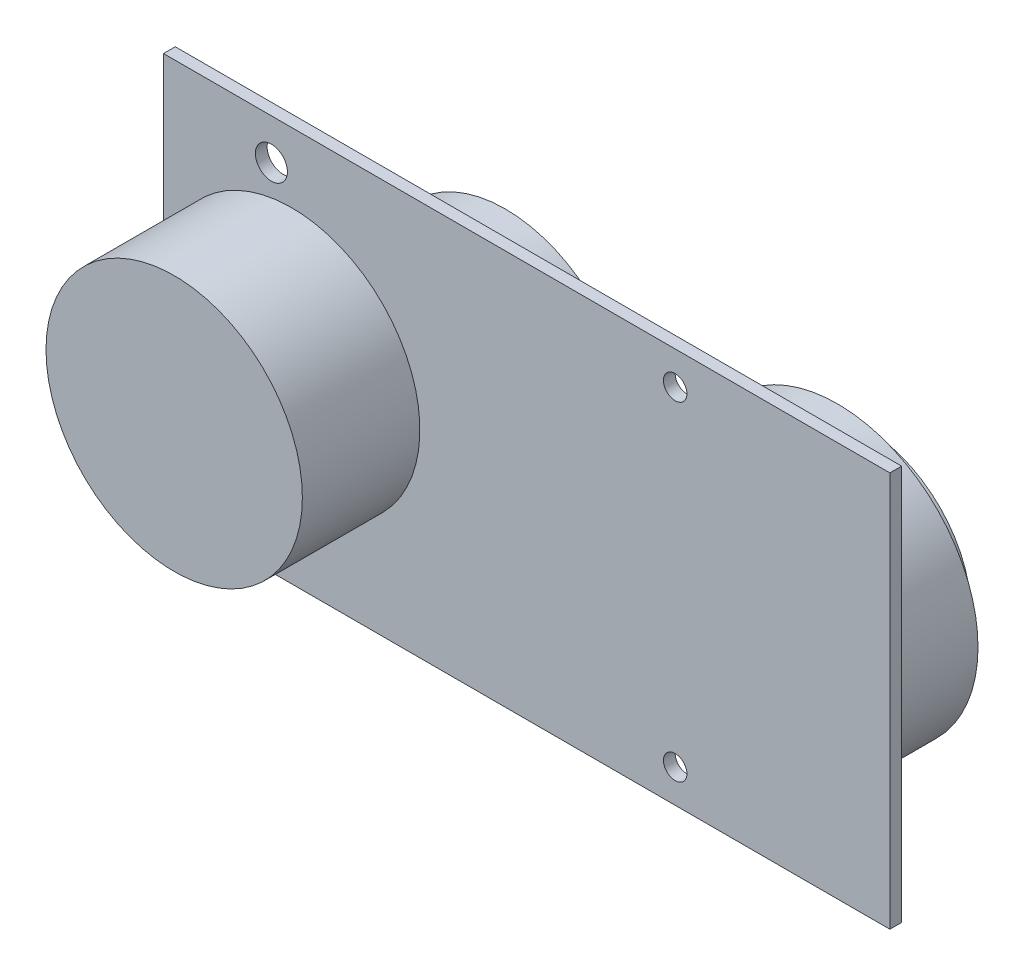
ISO-10303-21;
HEADER;
FILE_DESCRIPTION(('STEP AP214'),'2;1');
FILE_NAME('part.step','',(''),(''),'','','');
FILE_SCHEMA(('AUTOMOTIVE_DESIGN { 1 0 10303 214 1 1 1 1 }'));
ENDSEC;
DATA;
#1=APPLICATION_CONTEXT('core data for automotive mechanical design processes');
#2=APPLICATION_PROTOCOL_DEFINITION('international standard','automotive_design',2000,#1);
#3=PRODUCT_CONTEXT('',#1,'mechanical');
#4=PRODUCT('Part','Part','',(#3));
#5=PRODUCT_RELATED_PRODUCT_CATEGORY('part','',(#4));
#6=PRODUCT_DEFINITION_FORMATION('','',#4);
#7=PRODUCT_DEFINITION_CONTEXT('part definition',#1,'design');
#8=PRODUCT_DEFINITION('design','',#6,#7);
#9=PRODUCT_DEFINITION_SHAPE('','',#8);
#10=(LENGTH_UNIT() NAMED_UNIT(*) SI_UNIT(.MILLI.,.METRE.));
#11=(NAMED_UNIT(*) PLANE_ANGLE_UNIT() SI_UNIT($,.RADIAN.));
#12=(NAMED_UNIT(*) SI_UNIT($,.STERADIAN.) SOLID_ANGLE_UNIT());
#13=UNCERTAINTY_MEASURE_WITH_UNIT(LENGTH_MEASURE(1.E-05),#10,'distance_accuracy_value','');
#14=(GEOMETRIC_REPRESENTATION_CONTEXT(3) GLOBAL_UNCERTAINTY_ASSIGNED_CONTEXT((#13)) GLOBAL_UNIT_ASSIGNED_CONTEXT((#10,
#11,#12)) REPRESENTATION_CONTEXT('',''));
#15=CARTESIAN_POINT('',(0.,0.,0.));
#16=DIRECTION('',(0.,0.,1.));
#17=DIRECTION('',(1.,0.,0.));
#18=AXIS2_PLACEMENT_3D('',#15,#16,#17);
#19=CARTESIAN_POINT('',(13.5,3.6,-6.5));
#20=DIRECTION('',(0.,0.,1.));
#21=DIRECTION('',(1.,0.,0.));
#22=AXIS2_PLACEMENT_3D('',#19,#20,#21);
#23=CYLINDRICAL_SURFACE('',#22,11.8);
#24=DIRECTION('',(0.,0.,1.));
#25=VECTOR('',#24,1.);
#26=CARTESIAN_POINT('',(24.7938086489544,0.180952442447991,-4.4));
#27=LINE('',#26,#25);
#28=CARTESIAN_POINT('',(24.7938086489544,0.180952442447988,-6.5));
#29=VERTEX_POINT('',#28);
#30=CARTESIAN_POINT('',(24.7938086489544,0.180952442447991,-4.2));
#31=VERTEX_POINT('',#30);
#32=EDGE_CURVE('E265',#29,#31,#27,.T.);
#33=ORIENTED_EDGE('',*,*,#32,.F.);
#34=CARTESIAN_POINT('',(13.5,3.6,-6.5));
#35=DIRECTION('',(0.,0.,1.));
#36=DIRECTION('',(1.,0.,0.));
#37=AXIS2_PLACEMENT_3D('',#34,#35,#36);
#38=CIRCLE('',#37,11.8);
#39=CARTESIAN_POINT('',(1.75805879371044,2.43089063469696,-6.5));
#40=VERTEX_POINT('',#39);
#41=EDGE_CURVE('E199',#29,#40,#38,.T.);
#42=ORIENTED_EDGE('',*,*,#41,.T.);
#43=DIRECTION('',(0.,0.,1.));
#44=VECTOR('',#43,1.);
#45=CARTESIAN_POINT('',(1.75805879371044,2.43089063469696,-3.25));
#46=LINE('',#45,#44);
#47=CARTESIAN_POINT('',(1.75805879371044,2.43089063469696,-1.1));
#48=VERTEX_POINT('',#47);
#49=EDGE_CURVE('E158',#40,#48,#46,.T.);
#50=ORIENTED_EDGE('',*,*,#49,.T.);
#51=CARTESIAN_POINT('',(13.5,3.6,-1.1));
#52=DIRECTION('',(0.,0.,1.));
#53=DIRECTION('',(1.,0.,0.));
#54=AXIS2_PLACEMENT_3D('',#51,#52,#53);
#55=CIRCLE('',#54,11.8);
#56=CARTESIAN_POINT('',(22.8868703816798,10.7502912134781,-1.1));
#57=VERTEX_POINT('',#56);
#58=EDGE_CURVE('E184',#57,#48,#55,.T.);
#59=ORIENTED_EDGE('',*,*,#58,.F.);
#60=DIRECTION('',(0.,0.,1.));
#61=VECTOR('',#60,1.);
#62=CARTESIAN_POINT('',(22.8868703816798,10.7502912134781,-2.1));
#63=LINE('',#62,#61);
#64=CARTESIAN_POINT('',(22.8868703816798,10.7502912134781,-4.2));
#65=VERTEX_POINT('',#64);
#66=EDGE_CURVE('E146',#65,#57,#63,.T.);
#67=ORIENTED_EDGE('',*,*,#66,.F.);
#68=CARTESIAN_POINT('',(13.5,3.6,-4.2));
#69=DIRECTION('',(0.,0.,1.));
#70=DIRECTION('',(1.,0.,0.));
#71=AXIS2_PLACEMENT_3D('',#68,#69,#70);
#72=CIRCLE('',#71,11.8);
#73=EDGE_CURVE('E157',#65,#31,#72,.F.);
#74=ORIENTED_EDGE('',*,*,#73,.T.);
#75=EDGE_LOOP('',(#33,#42,#50,#59,#67,#74));
#76=FACE_BOUND('',#75,.T.);
#77=ADVANCED_FACE('F38',(#76),#23,.T.);
#78=CARTESIAN_POINT('',(26.7,-2.2,-4.2));
#79=DIRECTION('',(0.,0.,1.));
#80=DIRECTION('',(1.,0.,0.));
#81=AXIS2_PLACEMENT_3D('',#78,#79,#80);
#82=PLANE('',#81);
#83=CARTESIAN_POINT('',(42.6,0.,-4.2));
#84=DIRECTION('',(0.,0.,1.));
#85=DIRECTION('',(1.,0.,0.));
#86=AXIS2_PLACEMENT_3D('',#83,#84,#85);
#87=CIRCLE('',#86,13.15);
#88=CARTESIAN_POINT('',(29.4848009132115,-0.956061145483348,-4.2));
#89=VERTEX_POINT('',#88);
#90=CARTESIAN_POINT('',(33.4802744924266,9.47381162291688,-4.2));
#91=VERTEX_POINT('',#90);
#92=EDGE_CURVE('E275',#89,#91,#87,.F.);
#93=ORIENTED_EDGE('',*,*,#92,.F.);
#94=CARTESIAN_POINT('',(26.7,-2.2,-4.2));
#95=DIRECTION('',(0.,0.,1.));
#96=DIRECTION('',(1.,0.,0.));
#97=AXIS2_PLACEMENT_3D('',#94,#95,#96);
#98=CIRCLE('',#97,3.05);
#99=EDGE_CURVE('E11',#89,#31,#98,.T.);
#100=ORIENTED_EDGE('',*,*,#99,.T.);
#101=ORIENTED_EDGE('',*,*,#73,.F.);
#102=CARTESIAN_POINT('',(26.7,-2.2,-4.2));
#103=DIRECTION('',(0.,0.,1.));
#104=DIRECTION('',(1.,0.,0.));
#105=AXIS2_PLACEMENT_3D('',#102,#103,#104);
#106=CIRCLE('',#105,13.5);
#107=EDGE_CURVE('E176',#91,#65,#106,.T.);
#108=ORIENTED_EDGE('',*,*,#107,.F.);
#109=EDGE_LOOP('',(#93,#100,#101,#108));
#110=FACE_BOUND('',#109,.T.);
#111=ADVANCED_FACE('F281',(#110),#82,.F.);
#112=CARTESIAN_POINT('',(42.6,0.,-11.));
#113=DIRECTION('',(0.,0.,1.));
#114=DIRECTION('',(1.,0.,0.));
#115=AXIS2_PLACEMENT_3D('',#112,#113,#114);
#116=CYLINDRICAL_SURFACE('',#115,13.15);
#117=DIRECTION('',(0.,0.,1.));
#118=VECTOR('',#117,1.);
#119=CARTESIAN_POINT('',(29.7179431193908,-2.64104345377922,-4.4));
#120=LINE('',#119,#118);
#121=CARTESIAN_POINT('',(29.7179431193908,-2.64104345377922,-8.5));
#122=VERTEX_POINT('',#121);
#123=CARTESIAN_POINT('',(29.7179431193908,-2.64104345377922,-4.2));
#124=VERTEX_POINT('',#123);
#125=EDGE_CURVE('E53',#122,#124,#120,.T.);
#126=ORIENTED_EDGE('',*,*,#125,.F.);
#127=CARTESIAN_POINT('',(42.6,0.,-8.5));
#128=DIRECTION('',(0.,0.,-1.));
#129=DIRECTION('',(-1.,0.,0.));
#130=AXIS2_PLACEMENT_3D('',#127,#128,#129);
#131=CIRCLE('',#130,13.15);
#132=CARTESIAN_POINT('',(29.4848009132115,-0.956061145483349,-8.5));
#133=VERTEX_POINT('',#132);
#134=EDGE_CURVE('E206',#133,#122,#131,.T.);
#135=ORIENTED_EDGE('',*,*,#134,.F.);
#136=DIRECTION('',(0.,0.,1.));
#137=VECTOR('',#136,1.);
#138=CARTESIAN_POINT('',(29.4848009132115,-0.956061145483348,-4.4));
#139=LINE('',#138,#137);
#140=EDGE_CURVE('E272',#89,#133,#139,.F.);
#141=ORIENTED_EDGE('',*,*,#140,.F.);
#142=ORIENTED_EDGE('',*,*,#92,.T.);
#143=DIRECTION('',(0.,0.,1.));
#144=VECTOR('',#143,1.);
#145=CARTESIAN_POINT('',(33.4802744924266,9.47381162291688,-2.1));
#146=LINE('',#145,#144);
#147=CARTESIAN_POINT('',(33.4802744924266,9.47381162291688,-1.1));
#148=VERTEX_POINT('',#147);
#149=EDGE_CURVE('E188',#148,#91,#146,.F.);
#150=ORIENTED_EDGE('',*,*,#149,.F.);
#151=CARTESIAN_POINT('',(42.6,0.,-1.1));
#152=DIRECTION('',(0.,0.,1.));
#153=DIRECTION('',(1.,0.,0.));
#154=AXIS2_PLACEMENT_3D('',#151,#152,#153);
#155=CIRCLE('',#154,13.15);
#156=CARTESIAN_POINT('',(36.3953406831993,-11.5941667558492,-1.1));
#157=VERTEX_POINT('',#156);
#158=EDGE_CURVE('E187',#157,#148,#155,.T.);
#159=ORIENTED_EDGE('',*,*,#158,.F.);
#160=DIRECTION('',(0.,0.,1.));
#161=VECTOR('',#160,1.);
#162=CARTESIAN_POINT('',(36.3953406831993,-11.5941667558492,-2.1));
#163=LINE('',#162,#161);
#164=CARTESIAN_POINT('',(36.3953406831993,-11.5941667558492,-4.2));
#165=VERTEX_POINT('',#164);
#166=EDGE_CURVE('E189',#165,#157,#163,.T.);
#167=ORIENTED_EDGE('',*,*,#166,.F.);
#168=EDGE_CURVE('E276',#165,#124,#87,.F.);
#169=ORIENTED_EDGE('',*,*,#168,.T.);
#170=EDGE_LOOP('',(#126,#135,#141,#142,#150,#159,#167,#169));
#171=FACE_BOUND('',#170,.T.);
#172=ADVANCED_FACE('F283',(#171),#116,.T.);
#173=CARTESIAN_POINT('',(0.,0.,11.));
#174=DIRECTION('',(0.,0.,-1.));
#175=DIRECTION('',(-1.,0.,0.));
#176=AXIS2_PLACEMENT_3D('',#173,#174,#175);
#177=CYLINDRICAL_SURFACE('',#176,12.);
#178=CARTESIAN_POINT('',(0.,0.,11.));
#179=DIRECTION('',(0.,0.,1.));
#180=DIRECTION('',(1.,0.,0.));
#181=AXIS2_PLACEMENT_3D('',#178,#179,#180);
#182=CIRCLE('',#181,12.);
#183=CARTESIAN_POINT('',(12.,0.,11.));
#184=VERTEX_POINT('',#183);
#185=EDGE_CURVE('E248',#184,#184,#182,.T.);
#186=ORIENTED_EDGE('',*,*,#185,.F.);
#187=EDGE_LOOP('',(#186));
#188=FACE_BOUND('',#187,.T.);
#189=CARTESIAN_POINT('',(0.,0.,0.));
#190=DIRECTION('',(0.,0.,1.));
#191=DIRECTION('',(1.,0.,0.));
#192=AXIS2_PLACEMENT_3D('',#189,#190,#191);
#193=CIRCLE('',#192,12.);
#194=CARTESIAN_POINT('',(-12.,0.,0.));
#195=VERTEX_POINT('',#194);
#196=EDGE_CURVE('E247',#195,#195,#193,.T.);
#197=ORIENTED_EDGE('',*,*,#196,.T.);
#198=EDGE_LOOP('',(#197));
#199=FACE_BOUND('',#198,.T.);
#200=ADVANCED_FACE('F40',(#188,#199),#177,.T.);
#201=CARTESIAN_POINT('',(0.,0.,11.));
#202=DIRECTION('',(0.,0.,1.));
#203=DIRECTION('',(1.,0.,0.));
#204=AXIS2_PLACEMENT_3D('',#201,#202,#203);
#205=PLANE('',#204);
#206=ORIENTED_EDGE('',*,*,#185,.T.);
#207=EDGE_LOOP('',(#206));
#208=FACE_BOUND('',#207,.T.);
#209=ADVANCED_FACE('F413',(#208),#205,.T.);
#210=CARTESIAN_POINT('',(0.,0.,0.));
#211=DIRECTION('',(0.,0.,1.));
#212=DIRECTION('',(1.,0.,0.));
#213=AXIS2_PLACEMENT_3D('',#210,#211,#212);
#214=PLANE('',#213);
#215=CARTESIAN_POINT('',(-1.9,-14.7,0.));
#216=DIRECTION('',(0.,0.,1.));
#217=DIRECTION('',(1.,0.,0.));
#218=AXIS2_PLACEMENT_3D('',#215,#216,#217);
#219=CIRCLE('',#218,1.5);
#220=CARTESIAN_POINT('',(-0.400000000000001,-14.7,0.));
#221=VERTEX_POINT('',#220);
#222=EDGE_CURVE('E401',#221,#221,#219,.T.);
#223=ORIENTED_EDGE('',*,*,#222,.F.);
#224=EDGE_LOOP('',(#223));
#225=FACE_BOUND('',#224,.T.);
#226=CARTESIAN_POINT('',(-1.9,14.7,0.));
#227=DIRECTION('',(0.,0.,1.));
#228=DIRECTION('',(1.,0.,0.));
#229=AXIS2_PLACEMENT_3D('',#226,#227,#228);
#230=CIRCLE('',#229,1.5);
#231=CARTESIAN_POINT('',(-0.399999999999997,14.7,0.));
#232=VERTEX_POINT('',#231);
#233=EDGE_CURVE('E398',#232,#232,#230,.T.);
#234=ORIENTED_EDGE('',*,*,#233,.F.);
#235=EDGE_LOOP('',(#234));
#236=FACE_BOUND('',#235,.T.);
#237=CARTESIAN_POINT('',(35.9,15.4,0.));
#238=DIRECTION('',(0.,0.,1.));
#239=DIRECTION('',(1.,0.,0.));
#240=AXIS2_PLACEMENT_3D('',#237,#238,#239);
#241=CIRCLE('',#240,1.1);
#242=CARTESIAN_POINT('',(37.,15.4,0.));
#243=VERTEX_POINT('',#242);
#244=EDGE_CURVE('E395',#243,#243,#241,.T.);
#245=ORIENTED_EDGE('',*,*,#244,.F.);
#246=EDGE_LOOP('',(#245));
#247=FACE_BOUND('',#246,.T.);
#248=CARTESIAN_POINT('',(35.9,-15.4,0.));
#249=DIRECTION('',(0.,0.,1.));
#250=DIRECTION('',(1.,0.,0.));
#251=AXIS2_PLACEMENT_3D('',#248,#249,#250);
#252=CIRCLE('',#251,1.1);
#253=CARTESIAN_POINT('',(37.,-15.4,0.));
#254=VERTEX_POINT('',#253);
#255=EDGE_CURVE('E392',#254,#254,#252,.T.);
#256=ORIENTED_EDGE('',*,*,#255,.F.);
#257=EDGE_LOOP('',(#256));
#258=FACE_BOUND('',#257,.T.);
#259=DIRECTION('',(0.,-1.,0.));
#260=VECTOR('',#259,1.);
#261=CARTESIAN_POINT('',(-12.,18.5,0.));
#262=LINE('',#261,#260);
#263=CARTESIAN_POINT('',(-12.,18.5,0.));
#264=VERTEX_POINT('',#263);
#265=EDGE_CURVE('E223',#264,#195,#262,.T.);
#266=ORIENTED_EDGE('',*,*,#265,.T.);
#267=ORIENTED_EDGE('',*,*,#196,.F.);
#268=CARTESIAN_POINT('',(-12.,-18.5,0.));
#269=VERTEX_POINT('',#268);
#270=EDGE_CURVE('E227',#195,#269,#262,.T.);
#271=ORIENTED_EDGE('',*,*,#270,.T.);
#272=DIRECTION('',(1.,0.,0.));
#273=VECTOR('',#272,1.);
#274=CARTESIAN_POINT('',(-12.,-18.5,0.));
#275=LINE('',#274,#273);
#276=CARTESIAN_POINT('',(56.,-18.5,0.));
#277=VERTEX_POINT('',#276);
#278=EDGE_CURVE('E226',#269,#277,#275,.T.);
#279=ORIENTED_EDGE('',*,*,#278,.T.);
#280=DIRECTION('',(0.,-1.,0.));
#281=VECTOR('',#280,1.);
#282=CARTESIAN_POINT('',(56.,18.5,0.));
#283=LINE('',#282,#281);
#284=CARTESIAN_POINT('',(56.,18.5,0.));
#285=VERTEX_POINT('',#284);
#286=EDGE_CURVE('E230',#285,#277,#283,.T.);
#287=ORIENTED_EDGE('',*,*,#286,.F.);
#288=DIRECTION('',(1.,0.,0.));
#289=VECTOR('',#288,1.);
#290=CARTESIAN_POINT('',(-12.,18.5,0.));
#291=LINE('',#290,#289);
#292=EDGE_CURVE('E215',#264,#285,#291,.T.);
#293=ORIENTED_EDGE('',*,*,#292,.F.);
#294=EDGE_LOOP('',(#266,#267,#271,#279,#287,#293));
#295=FACE_BOUND('',#294,.T.);
#296=ADVANCED_FACE('F409',(#225,#236,#247,#258,#295),#214,.T.);
#297=CARTESIAN_POINT('',(-12.,18.5,-1.1));
#298=DIRECTION('',(-1.,0.,0.));
#299=DIRECTION('',(0.,0.,1.));
#300=AXIS2_PLACEMENT_3D('',#297,#298,#299);
#301=PLANE('',#300);
#302=ORIENTED_EDGE('',*,*,#265,.F.);
#303=DIRECTION('',(0.,0.,1.));
#304=VECTOR('',#303,1.);
#305=CARTESIAN_POINT('',(-12.,18.5,-1.1));
#306=LINE('',#305,#304);
#307=CARTESIAN_POINT('',(-12.,18.5,-1.1));
#308=VERTEX_POINT('',#307);
#309=EDGE_CURVE('E234',#308,#264,#306,.T.);
#310=ORIENTED_EDGE('',*,*,#309,.F.);
#311=DIRECTION('',(0.,-1.,0.));
#312=VECTOR('',#311,1.);
#313=CARTESIAN_POINT('',(-12.,18.5,-1.1));
#314=LINE('',#313,#312);
#315=CARTESIAN_POINT('',(-12.,-18.5,-1.1));
#316=VERTEX_POINT('',#315);
#317=EDGE_CURVE('E211',#308,#316,#314,.T.);
#318=ORIENTED_EDGE('',*,*,#317,.T.);
#319=DIRECTION('',(0.,0.,1.));
#320=VECTOR('',#319,1.);
#321=CARTESIAN_POINT('',(-12.,-18.5,-1.1));
#322=LINE('',#321,#320);
#323=EDGE_CURVE('E222',#316,#269,#322,.T.);
#324=ORIENTED_EDGE('',*,*,#323,.T.);
#325=ORIENTED_EDGE('',*,*,#270,.F.);
#326=EDGE_LOOP('',(#302,#310,#318,#324,#325));
#327=FACE_BOUND('',#326,.T.);
#328=ADVANCED_FACE('F412',(#327),#301,.T.);
#329=CARTESIAN_POINT('',(-12.,18.5,-1.1));
#330=DIRECTION('',(0.,-1.,0.));
#331=DIRECTION('',(0.,0.,-1.));
#332=AXIS2_PLACEMENT_3D('',#329,#330,#331);
#333=PLANE('',#332);
#334=ORIENTED_EDGE('',*,*,#292,.T.);
#335=DIRECTION('',(0.,0.,1.));
#336=VECTOR('',#335,1.);
#337=CARTESIAN_POINT('',(56.,18.5,-1.1));
#338=LINE('',#337,#336);
#339=CARTESIAN_POINT('',(56.,18.5,-1.1));
#340=VERTEX_POINT('',#339);
#341=EDGE_CURVE('E237',#340,#285,#338,.T.);
#342=ORIENTED_EDGE('',*,*,#341,.F.);
#343=DIRECTION('',(1.,0.,0.));
#344=VECTOR('',#343,1.);
#345=CARTESIAN_POINT('',(-12.,18.5,-1.1));
#346=LINE('',#345,#344);
#347=EDGE_CURVE('E220',#308,#340,#346,.T.);
#348=ORIENTED_EDGE('',*,*,#347,.F.);
#349=ORIENTED_EDGE('',*,*,#309,.T.);
#350=EDGE_LOOP('',(#334,#342,#348,#349));
#351=FACE_BOUND('',#350,.T.);
#352=ADVANCED_FACE('F438',(#351),#333,.F.);
#353=CARTESIAN_POINT('',(56.,18.5,-1.1));
#354=DIRECTION('',(-1.,0.,0.));
#355=DIRECTION('',(0.,0.,1.));
#356=AXIS2_PLACEMENT_3D('',#353,#354,#355);
#357=PLANE('',#356);
#358=ORIENTED_EDGE('',*,*,#286,.T.);
#359=DIRECTION('',(0.,0.,1.));
#360=VECTOR('',#359,1.);
#361=CARTESIAN_POINT('',(56.,-18.5,-1.1));
#362=LINE('',#361,#360);
#363=CARTESIAN_POINT('',(56.,-18.5,-1.1));
#364=VERTEX_POINT('',#363);
#365=EDGE_CURVE('E240',#364,#277,#362,.T.);
#366=ORIENTED_EDGE('',*,*,#365,.F.);
#367=DIRECTION('',(0.,-1.,0.));
#368=VECTOR('',#367,1.);
#369=CARTESIAN_POINT('',(56.,18.5,-1.1));
#370=LINE('',#369,#368);
#371=EDGE_CURVE('E218',#340,#364,#370,.T.);
#372=ORIENTED_EDGE('',*,*,#371,.F.);
#373=ORIENTED_EDGE('',*,*,#341,.T.);
#374=EDGE_LOOP('',(#358,#366,#372,#373));
#375=FACE_BOUND('',#374,.T.);
#376=ADVANCED_FACE('F434',(#375),#357,.F.);
#377=CARTESIAN_POINT('',(-12.,-18.5,-1.1));
#378=DIRECTION('',(0.,-1.,0.));
#379=DIRECTION('',(0.,0.,-1.));
#380=AXIS2_PLACEMENT_3D('',#377,#378,#379);
#381=PLANE('',#380);
#382=ORIENTED_EDGE('',*,*,#278,.F.);
#383=ORIENTED_EDGE('',*,*,#323,.F.);
#384=DIRECTION('',(1.,0.,0.));
#385=VECTOR('',#384,1.);
#386=CARTESIAN_POINT('',(-12.,-18.5,-1.1));
#387=LINE('',#386,#385);
#388=EDGE_CURVE('E214',#316,#364,#387,.T.);
#389=ORIENTED_EDGE('',*,*,#388,.T.);
#390=ORIENTED_EDGE('',*,*,#365,.T.);
#391=EDGE_LOOP('',(#382,#383,#389,#390));
#392=FACE_BOUND('',#391,.T.);
#393=ADVANCED_FACE('F429',(#392),#381,.T.);
#394=CARTESIAN_POINT('',(0.,0.,-1.1));
#395=DIRECTION('',(0.,0.,1.));
#396=DIRECTION('',(1.,0.,0.));
#397=AXIS2_PLACEMENT_3D('',#394,#395,#396);
#398=PLANE('',#397);
#399=CARTESIAN_POINT('',(-1.9,-14.7,-1.1));
#400=DIRECTION('',(0.,0.,-1.));
#401=DIRECTION('',(-1.,0.,0.));
#402=AXIS2_PLACEMENT_3D('',#399,#400,#401);
#403=CIRCLE('',#402,1.5);
#404=CARTESIAN_POINT('',(-3.4,-14.7,-1.1));
#405=VERTEX_POINT('',#404);
#406=EDGE_CURVE('E369',#405,#405,#403,.T.);
#407=ORIENTED_EDGE('',*,*,#406,.F.);
#408=EDGE_LOOP('',(#407));
#409=FACE_BOUND('',#408,.T.);
#410=CARTESIAN_POINT('',(-1.9,14.7,-1.1));
#411=DIRECTION('',(0.,0.,-1.));
#412=DIRECTION('',(-1.,0.,0.));
#413=AXIS2_PLACEMENT_3D('',#410,#411,#412);
#414=CIRCLE('',#413,1.5);
#415=CARTESIAN_POINT('',(-3.4,14.7,-1.1));
#416=VERTEX_POINT('',#415);
#417=EDGE_CURVE('E373',#416,#416,#414,.T.);
#418=ORIENTED_EDGE('',*,*,#417,.F.);
#419=EDGE_LOOP('',(#418));
#420=FACE_BOUND('',#419,.T.);
#421=CARTESIAN_POINT('',(35.9,15.4,-1.1));
#422=DIRECTION('',(0.,0.,-1.));
#423=DIRECTION('',(-1.,0.,0.));
#424=AXIS2_PLACEMENT_3D('',#421,#422,#423);
#425=CIRCLE('',#424,1.1);
#426=CARTESIAN_POINT('',(34.8,15.4,-1.1));
#427=VERTEX_POINT('',#426);
#428=EDGE_CURVE('E384',#427,#427,#425,.T.);
#429=ORIENTED_EDGE('',*,*,#428,.F.);
#430=EDGE_LOOP('',(#429));
#431=FACE_BOUND('',#430,.T.);
#432=CARTESIAN_POINT('',(35.9,-15.4,-1.1));
#433=DIRECTION('',(0.,0.,-1.));
#434=DIRECTION('',(-1.,0.,0.));
#435=AXIS2_PLACEMENT_3D('',#432,#433,#434);
#436=CIRCLE('',#435,1.1);
#437=CARTESIAN_POINT('',(34.8,-15.4,-1.1));
#438=VERTEX_POINT('',#437);
#439=EDGE_CURVE('E387',#438,#438,#436,.T.);
#440=ORIENTED_EDGE('',*,*,#439,.F.);
#441=EDGE_LOOP('',(#440));
#442=FACE_BOUND('',#441,.T.);
#443=ORIENTED_EDGE('',*,*,#158,.T.);
#444=CARTESIAN_POINT('',(26.7,-2.2,-1.1));
#445=DIRECTION('',(0.,0.,1.));
#446=DIRECTION('',(1.,0.,0.));
#447=AXIS2_PLACEMENT_3D('',#444,#445,#446);
#448=CIRCLE('',#447,13.5);
#449=EDGE_CURVE('E173',#148,#57,#448,.T.);
#450=ORIENTED_EDGE('',*,*,#449,.T.);
#451=ORIENTED_EDGE('',*,*,#58,.T.);
#452=CARTESIAN_POINT('',(0.,0.,-1.1));
#453=DIRECTION('',(0.,0.,1.));
#454=DIRECTION('',(1.,0.,0.));
#455=AXIS2_PLACEMENT_3D('',#452,#453,#454);
#456=CIRCLE('',#455,3.);
#457=CARTESIAN_POINT('',(2.73502557696729,-1.23273480251624,-1.1));
#458=VERTEX_POINT('',#457);
#459=EDGE_CURVE('E236',#458,#48,#456,.F.);
#460=ORIENTED_EDGE('',*,*,#459,.F.);
#461=CARTESIAN_POINT('',(14.5820732396402,-8.15028159254299,-1.1));
#462=VERTEX_POINT('',#461);
#463=EDGE_CURVE('E195',#458,#462,#55,.T.);
#464=ORIENTED_EDGE('',*,*,#463,.T.);
#465=EDGE_CURVE('E191',#462,#157,#448,.T.);
#466=ORIENTED_EDGE('',*,*,#465,.T.);
#467=EDGE_LOOP('',(#443,#450,#451,#460,#464,#466));
#468=FACE_BOUND('',#467,.T.);
#469=ORIENTED_EDGE('',*,*,#317,.F.);
#470=ORIENTED_EDGE('',*,*,#347,.T.);
#471=ORIENTED_EDGE('',*,*,#371,.T.);
#472=ORIENTED_EDGE('',*,*,#388,.F.);
#473=EDGE_LOOP('',(#469,#470,#471,#472));
#474=FACE_BOUND('',#473,.T.);
#475=ADVANCED_FACE('F181',(#409,#420,#431,#442,#468,#474),#398,.F.);
#476=CARTESIAN_POINT('',(0.,0.,-9.));
#477=DIRECTION('',(0.,0.,1.));
#478=DIRECTION('',(1.,0.,0.));
#479=AXIS2_PLACEMENT_3D('',#476,#477,#478);
#480=PLANE('',#479);
#481=CARTESIAN_POINT('',(0.,0.,-9.));
#482=DIRECTION('',(0.,0.,1.));
#483=DIRECTION('',(1.,0.,0.));
#484=AXIS2_PLACEMENT_3D('',#481,#482,#483);
#485=CIRCLE('',#484,3.);
#486=CARTESIAN_POINT('',(3.,0.,-9.));
#487=VERTEX_POINT('',#486);
#488=EDGE_CURVE('E244',#487,#487,#485,.T.);
#489=ORIENTED_EDGE('',*,*,#488,.F.);
#490=EDGE_LOOP('',(#489));
#491=FACE_BOUND('',#490,.T.);
#492=ADVANCED_FACE('F441',(#491),#480,.F.);
#493=CARTESIAN_POINT('',(0.,0.,-9.));
#494=DIRECTION('',(0.,0.,1.));
#495=DIRECTION('',(1.,0.,0.));
#496=AXIS2_PLACEMENT_3D('',#493,#494,#495);
#497=CYLINDRICAL_SURFACE('',#496,3.);
#498=ORIENTED_EDGE('',*,*,#49,.F.);
#499=CARTESIAN_POINT('',(0.,0.,-6.5));
#500=DIRECTION('',(0.,0.,1.));
#501=DIRECTION('',(1.,0.,0.));
#502=AXIS2_PLACEMENT_3D('',#499,#500,#501);
#503=CIRCLE('',#502,3.);
#504=CARTESIAN_POINT('',(2.73502557696729,-1.23273480251623,-6.5));
#505=VERTEX_POINT('',#504);
#506=EDGE_CURVE('E251',#40,#505,#503,.F.);
#507=ORIENTED_EDGE('',*,*,#506,.T.);
#508=DIRECTION('',(0.,0.,1.));
#509=VECTOR('',#508,1.);
#510=CARTESIAN_POINT('',(2.73502557696729,-1.23273480251624,-3.25));
#511=LINE('',#510,#509);
#512=EDGE_CURVE('E163',#458,#505,#511,.F.);
#513=ORIENTED_EDGE('',*,*,#512,.F.);
#514=ORIENTED_EDGE('',*,*,#459,.T.);
#515=EDGE_LOOP('',(#498,#507,#513,#514));
#516=FACE_BOUND('',#515,.T.);
#517=ORIENTED_EDGE('',*,*,#488,.T.);
#518=EDGE_LOOP('',(#517));
#519=FACE_BOUND('',#518,.T.);
#520=ADVANCED_FACE('F259',(#516,#519),#497,.T.);
#521=CARTESIAN_POINT('',(42.6,0.,-8.5));
#522=DIRECTION('',(0.,0.,-1.));
#523=DIRECTION('',(-1.,0.,0.));
#524=AXIS2_PLACEMENT_3D('',#521,#522,#523);
#525=PLANE('',#524);
#526=CARTESIAN_POINT('',(26.7,-2.2,-8.5));
#527=DIRECTION('',(0.,0.,-1.));
#528=DIRECTION('',(-1.,0.,0.));
#529=AXIS2_PLACEMENT_3D('',#526,#527,#528);
#530=CIRCLE('',#529,3.05);
#531=EDGE_CURVE('E267',#133,#122,#530,.T.);
#532=ORIENTED_EDGE('',*,*,#531,.F.);
#533=ORIENTED_EDGE('',*,*,#134,.T.);
#534=EDGE_LOOP('',(#532,#533));
#535=FACE_BOUND('',#534,.T.);
#536=CARTESIAN_POINT('',(42.6,0.,-8.5));
#537=DIRECTION('',(0.,0.,-1.));
#538=DIRECTION('',(-1.,0.,0.));
#539=AXIS2_PLACEMENT_3D('',#536,#537,#538);
#540=CIRCLE('',#539,10.);
#541=CARTESIAN_POINT('',(32.6,0.,-8.5));
#542=VERTEX_POINT('',#541);
#543=EDGE_CURVE('E203',#542,#542,#540,.T.);
#544=ORIENTED_EDGE('',*,*,#543,.F.);
#545=EDGE_LOOP('',(#544));
#546=FACE_BOUND('',#545,.T.);
#547=ADVANCED_FACE('F287',(#535,#546),#525,.T.);
#548=CARTESIAN_POINT('',(42.6,0.,-8.5));
#549=DIRECTION('',(0.,0.,-1.));
#550=DIRECTION('',(-1.,0.,0.));
#551=AXIS2_PLACEMENT_3D('',#548,#549,#550);
#552=CYLINDRICAL_SURFACE('',#551,10.);
#553=ORIENTED_EDGE('',*,*,#543,.T.);
#554=EDGE_LOOP('',(#553));
#555=FACE_BOUND('',#554,.T.);
#556=CARTESIAN_POINT('',(42.6,0.,-11.));
#557=DIRECTION('',(0.,0.,-1.));
#558=DIRECTION('',(-1.,0.,0.));
#559=AXIS2_PLACEMENT_3D('',#556,#557,#558);
#560=CIRCLE('',#559,10.);
#561=CARTESIAN_POINT('',(32.6,0.,-11.));
#562=VERTEX_POINT('',#561);
#563=EDGE_CURVE('E198',#562,#562,#560,.T.);
#564=ORIENTED_EDGE('',*,*,#563,.F.);
#565=EDGE_LOOP('',(#564));
#566=FACE_BOUND('',#565,.T.);
#567=ADVANCED_FACE('F290',(#555,#566),#552,.T.);
#568=CARTESIAN_POINT('',(42.6,0.,-11.));
#569=DIRECTION('',(0.,0.,1.));
#570=DIRECTION('',(1.,0.,0.));
#571=AXIS2_PLACEMENT_3D('',#568,#569,#570);
#572=PLANE('',#571);
#573=CARTESIAN_POINT('',(48.85,0.,-11.));
#574=DIRECTION('',(0.,0.,-1.));
#575=DIRECTION('',(-1.,0.,0.));
#576=AXIS2_PLACEMENT_3D('',#573,#574,#575);
#577=CIRCLE('',#576,1.25);
#578=CARTESIAN_POINT('',(47.6,0.,-11.));
#579=VERTEX_POINT('',#578);
#580=EDGE_CURVE('E370',#579,#579,#577,.T.);
#581=ORIENTED_EDGE('',*,*,#580,.F.);
#582=EDGE_LOOP('',(#581));
#583=FACE_BOUND('',#582,.T.);
#584=CARTESIAN_POINT('',(36.35,0.,-11.));
#585=DIRECTION('',(0.,0.,-1.));
#586=DIRECTION('',(-1.,0.,0.));
#587=AXIS2_PLACEMENT_3D('',#584,#585,#586);
#588=CIRCLE('',#587,1.25);
#589=CARTESIAN_POINT('',(35.1,0.,-11.));
#590=VERTEX_POINT('',#589);
#591=EDGE_CURVE('E376',#590,#590,#588,.T.);
#592=ORIENTED_EDGE('',*,*,#591,.F.);
#593=EDGE_LOOP('',(#592));
#594=FACE_BOUND('',#593,.T.);
#595=ORIENTED_EDGE('',*,*,#563,.T.);
#596=EDGE_LOOP('',(#595));
#597=FACE_BOUND('',#596,.T.);
#598=ADVANCED_FACE('F296',(#583,#594,#597),#572,.F.);
#599=DIRECTION('',(0.,0.,1.));
#600=VECTOR('',#599,1.);
#601=CARTESIAN_POINT('',(23.6569850781959,-2.40630120134736,-4.4));
#602=LINE('',#601,#600);
#603=CARTESIAN_POINT('',(23.6569850781959,-2.40630120134736,-4.2));
#604=VERTEX_POINT('',#603);
#605=CARTESIAN_POINT('',(23.6569850781959,-2.40630120134736,-6.5));
#606=VERTEX_POINT('',#605);
#607=EDGE_CURVE('E142',#604,#606,#602,.F.);
#608=ORIENTED_EDGE('',*,*,#607,.F.);
#609=CARTESIAN_POINT('',(14.5820732396402,-8.15028159254299,-4.2));
#610=VERTEX_POINT('',#609);
#611=EDGE_CURVE('E61',#604,#610,#72,.F.);
#612=ORIENTED_EDGE('',*,*,#611,.T.);
#613=DIRECTION('',(0.,0.,1.));
#614=VECTOR('',#613,1.);
#615=CARTESIAN_POINT('',(14.5820732396402,-8.15028159254299,-2.1));
#616=LINE('',#615,#614);
#617=EDGE_CURVE('E161',#462,#610,#616,.F.);
#618=ORIENTED_EDGE('',*,*,#617,.F.);
#619=ORIENTED_EDGE('',*,*,#463,.F.);
#620=ORIENTED_EDGE('',*,*,#512,.T.);
#621=EDGE_CURVE('E150',#505,#606,#38,.T.);
#622=ORIENTED_EDGE('',*,*,#621,.T.);
#623=EDGE_LOOP('',(#608,#612,#618,#619,#620,#622));
#624=FACE_BOUND('',#623,.T.);
#625=ADVANCED_FACE('F148',(#624),#23,.T.);
#626=CARTESIAN_POINT('',(13.5,3.6,-6.5));
#627=DIRECTION('',(0.,0.,1.));
#628=DIRECTION('',(1.,0.,0.));
#629=AXIS2_PLACEMENT_3D('',#626,#627,#628);
#630=PLANE('',#629);
#631=ORIENTED_EDGE('',*,*,#41,.F.);
#632=CARTESIAN_POINT('',(26.7,-2.2,-6.5));
#633=DIRECTION('',(0.,0.,1.));
#634=DIRECTION('',(1.,0.,0.));
#635=AXIS2_PLACEMENT_3D('',#632,#633,#634);
#636=CIRCLE('',#635,3.05);
#637=EDGE_CURVE('E264',#29,#606,#636,.T.);
#638=ORIENTED_EDGE('',*,*,#637,.T.);
#639=ORIENTED_EDGE('',*,*,#621,.F.);
#640=ORIENTED_EDGE('',*,*,#506,.F.);
#641=EDGE_LOOP('',(#631,#638,#639,#640));
#642=FACE_BOUND('',#641,.T.);
#643=ADVANCED_FACE('F263',(#642),#630,.F.);
#644=CARTESIAN_POINT('',(26.7,-2.2,-4.2));
#645=DIRECTION('',(0.,0.,1.));
#646=DIRECTION('',(1.,0.,0.));
#647=AXIS2_PLACEMENT_3D('',#644,#645,#646);
#648=CYLINDRICAL_SURFACE('',#647,13.5);
#649=ORIENTED_EDGE('',*,*,#449,.F.);
#650=ORIENTED_EDGE('',*,*,#149,.T.);
#651=ORIENTED_EDGE('',*,*,#107,.T.);
#652=ORIENTED_EDGE('',*,*,#66,.T.);
#653=EDGE_LOOP('',(#649,#650,#651,#652));
#654=FACE_BOUND('',#653,.T.);
#655=ADVANCED_FACE('F171',(#654),#648,.T.);
#656=EDGE_CURVE('E155',#610,#165,#106,.T.);
#657=ORIENTED_EDGE('',*,*,#656,.T.);
#658=ORIENTED_EDGE('',*,*,#166,.T.);
#659=ORIENTED_EDGE('',*,*,#465,.F.);
#660=ORIENTED_EDGE('',*,*,#617,.T.);
#661=EDGE_LOOP('',(#657,#658,#659,#660));
#662=FACE_BOUND('',#661,.T.);
#663=ADVANCED_FACE('F321',(#662),#648,.T.);
#664=ORIENTED_EDGE('',*,*,#611,.F.);
#665=EDGE_CURVE('E42',#604,#124,#98,.T.);
#666=ORIENTED_EDGE('',*,*,#665,.T.);
#667=ORIENTED_EDGE('',*,*,#168,.F.);
#668=ORIENTED_EDGE('',*,*,#656,.F.);
#669=EDGE_LOOP('',(#664,#666,#667,#668));
#670=FACE_BOUND('',#669,.T.);
#671=ADVANCED_FACE('F153',(#670),#82,.F.);
#672=CARTESIAN_POINT('',(26.7,-2.2,-8.8));
#673=DIRECTION('',(0.,0.,1.));
#674=DIRECTION('',(1.,0.,0.));
#675=AXIS2_PLACEMENT_3D('',#672,#673,#674);
#676=CYLINDRICAL_SURFACE('',#675,3.05);
#677=CARTESIAN_POINT('',(26.7,-2.2,-8.8));
#678=DIRECTION('',(0.,0.,1.));
#679=DIRECTION('',(1.,0.,0.));
#680=AXIS2_PLACEMENT_3D('',#677,#678,#679);
#681=CIRCLE('',#680,3.05);
#682=CARTESIAN_POINT('',(29.75,-2.2,-8.8));
#683=VERTEX_POINT('',#682);
#684=EDGE_CURVE('E151',#683,#683,#681,.T.);
#685=ORIENTED_EDGE('',*,*,#684,.T.);
#686=EDGE_LOOP('',(#685));
#687=FACE_BOUND('',#686,.T.);
#688=ORIENTED_EDGE('',*,*,#99,.F.);
#689=ORIENTED_EDGE('',*,*,#140,.T.);
#690=ORIENTED_EDGE('',*,*,#531,.T.);
#691=ORIENTED_EDGE('',*,*,#125,.T.);
#692=ORIENTED_EDGE('',*,*,#665,.F.);
#693=ORIENTED_EDGE('',*,*,#607,.T.);
#694=ORIENTED_EDGE('',*,*,#637,.F.);
#695=ORIENTED_EDGE('',*,*,#32,.T.);
#696=EDGE_LOOP('',(#688,#689,#690,#691,#692,#693,#694,#695));
#697=FACE_BOUND('',#696,.T.);
#698=ADVANCED_FACE('F141',(#687,#697),#676,.T.);
#699=CARTESIAN_POINT('',(26.7,-2.2,-8.8));
#700=DIRECTION('',(0.,0.,1.));
#701=DIRECTION('',(1.,0.,0.));
#702=AXIS2_PLACEMENT_3D('',#699,#700,#701);
#703=PLANE('',#702);
#704=ORIENTED_EDGE('',*,*,#684,.F.);
#705=EDGE_LOOP('',(#704));
#706=FACE_BOUND('',#705,.T.);
#707=ADVANCED_FACE('F328',(#706),#703,.F.);
#708=CARTESIAN_POINT('',(35.9,-15.4,11.));
#709=DIRECTION('',(0.,0.,-1.));
#710=DIRECTION('',(-1.,0.,0.));
#711=AXIS2_PLACEMENT_3D('',#708,#709,#710);
#712=CYLINDRICAL_SURFACE('',#711,1.1);
#713=ORIENTED_EDGE('',*,*,#255,.T.);
#714=EDGE_LOOP('',(#713));
#715=FACE_BOUND('',#714,.T.);
#716=ORIENTED_EDGE('',*,*,#439,.T.);
#717=EDGE_LOOP('',(#716));
#718=FACE_BOUND('',#717,.T.);
#719=ADVANCED_FACE('F332',(#715,#718),#712,.F.);
#720=CARTESIAN_POINT('',(35.9,15.4,11.));
#721=DIRECTION('',(0.,0.,-1.));
#722=DIRECTION('',(-1.,0.,0.));
#723=AXIS2_PLACEMENT_3D('',#720,#721,#722);
#724=CYLINDRICAL_SURFACE('',#723,1.1);
#725=ORIENTED_EDGE('',*,*,#244,.T.);
#726=EDGE_LOOP('',(#725));
#727=FACE_BOUND('',#726,.T.);
#728=ORIENTED_EDGE('',*,*,#428,.T.);
#729=EDGE_LOOP('',(#728));
#730=FACE_BOUND('',#729,.T.);
#731=ADVANCED_FACE('F336',(#727,#730),#724,.F.);
#732=CARTESIAN_POINT('',(-1.9,14.7,11.));
#733=DIRECTION('',(0.,0.,-1.));
#734=DIRECTION('',(-1.,0.,0.));
#735=AXIS2_PLACEMENT_3D('',#732,#733,#734);
#736=CYLINDRICAL_SURFACE('',#735,1.5);
#737=ORIENTED_EDGE('',*,*,#233,.T.);
#738=EDGE_LOOP('',(#737));
#739=FACE_BOUND('',#738,.T.);
#740=ORIENTED_EDGE('',*,*,#417,.T.);
#741=EDGE_LOOP('',(#740));
#742=FACE_BOUND('',#741,.T.);
#743=ADVANCED_FACE('F342',(#739,#742),#736,.F.);
#744=CARTESIAN_POINT('',(-1.9,-14.7,11.));
#745=DIRECTION('',(0.,0.,-1.));
#746=DIRECTION('',(-1.,0.,0.));
#747=AXIS2_PLACEMENT_3D('',#744,#745,#746);
#748=CYLINDRICAL_SURFACE('',#747,1.5);
#749=ORIENTED_EDGE('',*,*,#222,.T.);
#750=EDGE_LOOP('',(#749));
#751=FACE_BOUND('',#750,.T.);
#752=ORIENTED_EDGE('',*,*,#406,.T.);
#753=EDGE_LOOP('',(#752));
#754=FACE_BOUND('',#753,.T.);
#755=ADVANCED_FACE('F338',(#751,#754),#748,.F.);
#756=CARTESIAN_POINT('',(36.35,0.,-4.96446609406725));
#757=DIRECTION('',(0.,0.,-1.));
#758=DIRECTION('',(-1.,0.,0.));
#759=AXIS2_PLACEMENT_3D('',#756,#757,#758);
#760=CYLINDRICAL_SURFACE('',#759,1.25);
#761=CARTESIAN_POINT('',(36.35,0.,-8.5));
#762=DIRECTION('',(0.,0.,-1.));
#763=DIRECTION('',(-1.,0.,0.));
#764=AXIS2_PLACEMENT_3D('',#761,#762,#763);
#765=CIRCLE('',#764,1.25);
#766=CARTESIAN_POINT('',(35.1,0.,-8.5));
#767=VERTEX_POINT('',#766);
#768=EDGE_CURVE('E379',#767,#767,#765,.F.);
#769=ORIENTED_EDGE('',*,*,#768,.T.);
#770=EDGE_LOOP('',(#769));
#771=FACE_BOUND('',#770,.T.);
#772=ORIENTED_EDGE('',*,*,#591,.T.);
#773=EDGE_LOOP('',(#772));
#774=FACE_BOUND('',#773,.T.);
#775=ADVANCED_FACE('F341',(#771,#774),#760,.F.);
#776=CARTESIAN_POINT('',(42.6,0.,-8.5));
#777=DIRECTION('',(0.,0.,-1.));
#778=DIRECTION('',(-1.,0.,0.));
#779=AXIS2_PLACEMENT_3D('',#776,#777,#778);
#780=PLANE('',#779);
#781=ORIENTED_EDGE('',*,*,#768,.F.);
#782=EDGE_LOOP('',(#781));
#783=FACE_BOUND('',#782,.T.);
#784=ADVANCED_FACE('F350',(#783),#780,.T.);
#785=CARTESIAN_POINT('',(48.85,0.,-4.96446609406725));
#786=DIRECTION('',(0.,0.,-1.));
#787=DIRECTION('',(-1.,0.,0.));
#788=AXIS2_PLACEMENT_3D('',#785,#786,#787);
#789=CYLINDRICAL_SURFACE('',#788,1.25);
#790=CARTESIAN_POINT('',(48.85,0.,-8.5));
#791=DIRECTION('',(0.,0.,-1.));
#792=DIRECTION('',(-1.,0.,0.));
#793=AXIS2_PLACEMENT_3D('',#790,#791,#792);
#794=CIRCLE('',#793,1.25);
#795=CARTESIAN_POINT('',(47.6,0.,-8.5));
#796=VERTEX_POINT('',#795);
#797=EDGE_CURVE('E368',#796,#796,#794,.F.);
#798=ORIENTED_EDGE('',*,*,#797,.T.);
#799=EDGE_LOOP('',(#798));
#800=FACE_BOUND('',#799,.T.);
#801=ORIENTED_EDGE('',*,*,#580,.T.);
#802=EDGE_LOOP('',(#801));
#803=FACE_BOUND('',#802,.T.);
#804=ADVANCED_FACE('F353',(#800,#803),#789,.F.);
#805=CARTESIAN_POINT('',(42.6,0.,-8.5));
#806=DIRECTION('',(0.,0.,-1.));
#807=DIRECTION('',(-1.,0.,0.));
#808=AXIS2_PLACEMENT_3D('',#805,#806,#807);
#809=PLANE('',#808);
#810=ORIENTED_EDGE('',*,*,#797,.F.);
#811=EDGE_LOOP('',(#810));
#812=FACE_BOUND('',#811,.T.);
#813=ADVANCED_FACE('F360',(#812),#809,.T.);
#814=CLOSED_SHELL('',(#77,#111,#172,#200,#209,#296,#328,#352,#376,#393,#475,#492,#520,#547,#567,
#598,#625,#643,#655,#663,#671,#698,#707,#719,#731,#743,#755,#775,#784,#804,#813));
#815=MANIFOLD_SOLID_BREP('B2',#814);
#816=ADVANCED_BREP_SHAPE_REPRESENTATION('',(#18,#815),#14);
#817=SHAPE_DEFINITION_REPRESENTATION(#9,#816);
ENDSEC;
END-ISO-10303-21;
